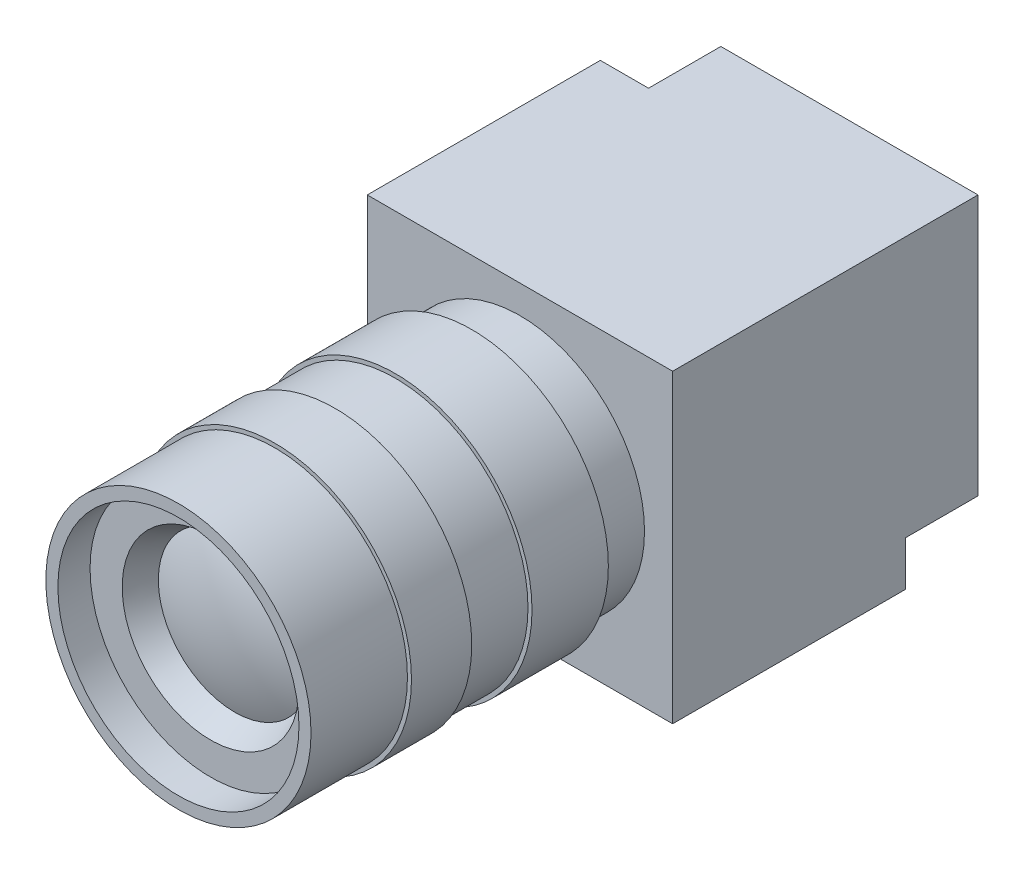
ISO-10303-21;
HEADER;
FILE_DESCRIPTION(('STEP AP214'),'2;1');
FILE_NAME('part.step','',(''),(''),'','','');
FILE_SCHEMA(('AUTOMOTIVE_DESIGN { 1 0 10303 214 1 1 1 1 }'));
ENDSEC;
DATA;
#1=APPLICATION_CONTEXT('core data for automotive mechanical design processes');
#2=APPLICATION_PROTOCOL_DEFINITION('international standard','automotive_design',2000,#1);
#3=PRODUCT_CONTEXT('',#1,'mechanical');
#4=PRODUCT('Part','Part','',(#3));
#5=PRODUCT_RELATED_PRODUCT_CATEGORY('part','',(#4));
#6=PRODUCT_DEFINITION_FORMATION('','',#4);
#7=PRODUCT_DEFINITION_CONTEXT('part definition',#1,'design');
#8=PRODUCT_DEFINITION('design','',#6,#7);
#9=PRODUCT_DEFINITION_SHAPE('','',#8);
#10=(LENGTH_UNIT() NAMED_UNIT(*) SI_UNIT(.MILLI.,.METRE.));
#11=(NAMED_UNIT(*) PLANE_ANGLE_UNIT() SI_UNIT($,.RADIAN.));
#12=(NAMED_UNIT(*) SI_UNIT($,.STERADIAN.) SOLID_ANGLE_UNIT());
#13=UNCERTAINTY_MEASURE_WITH_UNIT(LENGTH_MEASURE(1.E-05),#10,'distance_accuracy_value','');
#14=(GEOMETRIC_REPRESENTATION_CONTEXT(3) GLOBAL_UNCERTAINTY_ASSIGNED_CONTEXT((#13)) GLOBAL_UNIT_ASSIGNED_CONTEXT((#10,
#11,#12)) REPRESENTATION_CONTEXT('',''));
#15=CARTESIAN_POINT('',(0.,0.,0.));
#16=DIRECTION('',(0.,0.,1.));
#17=DIRECTION('',(1.,0.,0.));
#18=AXIS2_PLACEMENT_3D('',#15,#16,#17);
#19=CARTESIAN_POINT('',(-19.,19.,38.));
#20=DIRECTION('',(1.,0.,0.));
#21=DIRECTION('',(0.,1.,0.));
#22=AXIS2_PLACEMENT_3D('',#19,#20,#21);
#23=PLANE('',#22);
#24=DIRECTION('',(0.,1.,0.));
#25=VECTOR('',#24,1.);
#26=CARTESIAN_POINT('',(-19.,-19.,9.));
#27=LINE('',#26,#25);
#28=CARTESIAN_POINT('',(-19.,-19.,9.));
#29=VERTEX_POINT('',#28);
#30=CARTESIAN_POINT('',(-19.,19.,9.));
#31=VERTEX_POINT('',#30);
#32=EDGE_CURVE('E132',#29,#31,#27,.T.);
#33=ORIENTED_EDGE('',*,*,#32,.F.);
#34=DIRECTION('',(0.,0.,-1.));
#35=VECTOR('',#34,1.);
#36=CARTESIAN_POINT('',(-19.,-19.,38.));
#37=LINE('',#36,#35);
#38=CARTESIAN_POINT('',(-19.,-19.,38.));
#39=VERTEX_POINT('',#38);
#40=EDGE_CURVE('E11',#39,#29,#37,.T.);
#41=ORIENTED_EDGE('',*,*,#40,.F.);
#42=DIRECTION('',(0.,-1.,0.));
#43=VECTOR('',#42,1.);
#44=CARTESIAN_POINT('',(-19.,19.,38.));
#45=LINE('',#44,#43);
#46=CARTESIAN_POINT('',(-19.,19.,38.));
#47=VERTEX_POINT('',#46);
#48=EDGE_CURVE('E199',#47,#39,#45,.T.);
#49=ORIENTED_EDGE('',*,*,#48,.F.);
#50=DIRECTION('',(0.,0.,-1.));
#51=VECTOR('',#50,1.);
#52=CARTESIAN_POINT('',(-19.,19.,38.));
#53=LINE('',#52,#51);
#54=EDGE_CURVE('E206',#47,#31,#53,.T.);
#55=ORIENTED_EDGE('',*,*,#54,.T.);
#56=EDGE_LOOP('',(#33,#41,#49,#55));
#57=FACE_BOUND('',#56,.T.);
#58=ADVANCED_FACE('F30',(#57),#23,.F.);
#59=CARTESIAN_POINT('',(-19.,-19.,38.));
#60=DIRECTION('',(0.,1.,0.));
#61=DIRECTION('',(0.,0.,1.));
#62=AXIS2_PLACEMENT_3D('',#59,#60,#61);
#63=PLANE('',#62);
#64=DIRECTION('',(-1.,0.,0.));
#65=VECTOR('',#64,1.);
#66=CARTESIAN_POINT('',(19.,-19.,9.));
#67=LINE('',#66,#65);
#68=CARTESIAN_POINT('',(19.,-19.,9.));
#69=VERTEX_POINT('',#68);
#70=EDGE_CURVE('E130',#69,#29,#67,.T.);
#71=ORIENTED_EDGE('',*,*,#70,.F.);
#72=DIRECTION('',(0.,0.,-1.));
#73=VECTOR('',#72,1.);
#74=CARTESIAN_POINT('',(19.,-19.,38.));
#75=LINE('',#74,#73);
#76=CARTESIAN_POINT('',(19.,-19.,38.));
#77=VERTEX_POINT('',#76);
#78=EDGE_CURVE('E37',#77,#69,#75,.T.);
#79=ORIENTED_EDGE('',*,*,#78,.F.);
#80=DIRECTION('',(1.,0.,0.));
#81=VECTOR('',#80,1.);
#82=CARTESIAN_POINT('',(-19.,-19.,38.));
#83=LINE('',#82,#81);
#84=EDGE_CURVE('E201',#39,#77,#83,.T.);
#85=ORIENTED_EDGE('',*,*,#84,.F.);
#86=ORIENTED_EDGE('',*,*,#40,.T.);
#87=EDGE_LOOP('',(#71,#79,#85,#86));
#88=FACE_BOUND('',#87,.T.);
#89=ADVANCED_FACE('F220',(#88),#63,.F.);
#90=CARTESIAN_POINT('',(0.,0.,80.5));
#91=DIRECTION('',(0.,0.,1.));
#92=DIRECTION('',(1.,0.,0.));
#93=AXIS2_PLACEMENT_3D('',#90,#91,#92);
#94=PLANE('',#93);
#95=CARTESIAN_POINT('',(0.,0.,80.5));
#96=DIRECTION('',(0.,0.,1.));
#97=DIRECTION('',(1.,0.,0.));
#98=AXIS2_PLACEMENT_3D('',#95,#96,#97);
#99=CIRCLE('',#98,16.5);
#100=CARTESIAN_POINT('',(16.5,0.,80.5));
#101=VERTEX_POINT('',#100);
#102=EDGE_CURVE('E168',#101,#101,#99,.T.);
#103=ORIENTED_EDGE('',*,*,#102,.T.);
#104=EDGE_LOOP('',(#103));
#105=FACE_BOUND('',#104,.T.);
#106=CARTESIAN_POINT('',(0.,0.,80.5));
#107=DIRECTION('',(0.,0.,1.));
#108=DIRECTION('',(1.,0.,0.));
#109=AXIS2_PLACEMENT_3D('',#106,#107,#108);
#110=CIRCLE('',#109,15.);
#111=CARTESIAN_POINT('',(15.,0.,80.5));
#112=VERTEX_POINT('',#111);
#113=EDGE_CURVE('E149',#112,#112,#110,.T.);
#114=ORIENTED_EDGE('',*,*,#113,.F.);
#115=EDGE_LOOP('',(#114));
#116=FACE_BOUND('',#115,.T.);
#117=ADVANCED_FACE('F249',(#105,#116),#94,.T.);
#118=CARTESIAN_POINT('',(0.,0.,68.5));
#119=DIRECTION('',(0.,0.,1.));
#120=DIRECTION('',(1.,0.,0.));
#121=AXIS2_PLACEMENT_3D('',#118,#119,#120);
#122=PLANE('',#121);
#123=CARTESIAN_POINT('',(0.,0.,68.5));
#124=DIRECTION('',(0.,0.,1.));
#125=DIRECTION('',(1.,0.,0.));
#126=AXIS2_PLACEMENT_3D('',#123,#124,#125);
#127=CIRCLE('',#126,17.);
#128=CARTESIAN_POINT('',(17.,0.,68.5));
#129=VERTEX_POINT('',#128);
#130=EDGE_CURVE('E174',#129,#129,#127,.T.);
#131=ORIENTED_EDGE('',*,*,#130,.T.);
#132=EDGE_LOOP('',(#131));
#133=FACE_BOUND('',#132,.T.);
#134=CARTESIAN_POINT('',(0.,0.,68.5));
#135=DIRECTION('',(0.,0.,1.));
#136=DIRECTION('',(1.,0.,0.));
#137=AXIS2_PLACEMENT_3D('',#134,#135,#136);
#138=CIRCLE('',#137,16.5);
#139=CARTESIAN_POINT('',(16.5,0.,68.5));
#140=VERTEX_POINT('',#139);
#141=EDGE_CURVE('E165',#140,#140,#138,.T.);
#142=ORIENTED_EDGE('',*,*,#141,.F.);
#143=EDGE_LOOP('',(#142));
#144=FACE_BOUND('',#143,.T.);
#145=ADVANCED_FACE('F253',(#133,#144),#122,.T.);
#146=CARTESIAN_POINT('',(0.,0.,53.5));
#147=DIRECTION('',(0.,0.,1.));
#148=DIRECTION('',(1.,0.,0.));
#149=AXIS2_PLACEMENT_3D('',#146,#147,#148);
#150=PLANE('',#149);
#151=CARTESIAN_POINT('',(0.,0.,53.5));
#152=DIRECTION('',(0.,0.,1.));
#153=DIRECTION('',(1.,0.,0.));
#154=AXIS2_PLACEMENT_3D('',#151,#152,#153);
#155=CIRCLE('',#154,17.);
#156=CARTESIAN_POINT('',(17.,0.,53.5));
#157=VERTEX_POINT('',#156);
#158=EDGE_CURVE('E186',#157,#157,#155,.T.);
#159=ORIENTED_EDGE('',*,*,#158,.T.);
#160=EDGE_LOOP('',(#159));
#161=FACE_BOUND('',#160,.T.);
#162=CARTESIAN_POINT('',(0.,0.,53.5));
#163=DIRECTION('',(0.,0.,1.));
#164=DIRECTION('',(1.,0.,0.));
#165=AXIS2_PLACEMENT_3D('',#162,#163,#164);
#166=CIRCLE('',#165,16.5);
#167=CARTESIAN_POINT('',(16.5,0.,53.5));
#168=VERTEX_POINT('',#167);
#169=EDGE_CURVE('E177',#168,#168,#166,.T.);
#170=ORIENTED_EDGE('',*,*,#169,.F.);
#171=EDGE_LOOP('',(#170));
#172=FACE_BOUND('',#171,.T.);
#173=ADVANCED_FACE('F264',(#161,#172),#150,.T.);
#174=CARTESIAN_POINT('',(-19.,-19.,38.));
#175=DIRECTION('',(0.,0.,1.));
#176=DIRECTION('',(1.,0.,0.));
#177=AXIS2_PLACEMENT_3D('',#174,#175,#176);
#178=PLANE('',#177);
#179=ORIENTED_EDGE('',*,*,#48,.T.);
#180=ORIENTED_EDGE('',*,*,#84,.T.);
#181=DIRECTION('',(0.,1.,0.));
#182=VECTOR('',#181,1.);
#183=CARTESIAN_POINT('',(19.,19.,38.));
#184=LINE('',#183,#182);
#185=CARTESIAN_POINT('',(19.,19.,38.));
#186=VERTEX_POINT('',#185);
#187=EDGE_CURVE('E203',#77,#186,#184,.T.);
#188=ORIENTED_EDGE('',*,*,#187,.T.);
#189=DIRECTION('',(-1.,0.,0.));
#190=VECTOR('',#189,1.);
#191=CARTESIAN_POINT('',(-19.,19.,38.));
#192=LINE('',#191,#190);
#193=EDGE_CURVE('E52',#186,#47,#192,.T.);
#194=ORIENTED_EDGE('',*,*,#193,.T.);
#195=EDGE_LOOP('',(#179,#180,#188,#194));
#196=FACE_BOUND('',#195,.T.);
#197=CARTESIAN_POINT('',(0.,0.,38.));
#198=DIRECTION('',(0.,0.,1.));
#199=DIRECTION('',(1.,0.,0.));
#200=AXIS2_PLACEMENT_3D('',#197,#198,#199);
#201=CIRCLE('',#200,15.5);
#202=CARTESIAN_POINT('',(15.5,0.,38.));
#203=VERTEX_POINT('',#202);
#204=EDGE_CURVE('E189',#203,#203,#201,.T.);
#205=ORIENTED_EDGE('',*,*,#204,.F.);
#206=EDGE_LOOP('',(#205));
#207=FACE_BOUND('',#206,.T.);
#208=ADVANCED_FACE('F259',(#196,#207),#178,.T.);
#209=CARTESIAN_POINT('',(19.,19.,38.));
#210=DIRECTION('',(-1.,0.,0.));
#211=DIRECTION('',(0.,-1.,0.));
#212=AXIS2_PLACEMENT_3D('',#209,#210,#211);
#213=PLANE('',#212);
#214=DIRECTION('',(0.,-1.,0.));
#215=VECTOR('',#214,1.);
#216=CARTESIAN_POINT('',(19.,-13.4399999999997,9.));
#217=LINE('',#216,#215);
#218=CARTESIAN_POINT('',(19.,-13.4399999999997,9.));
#219=VERTEX_POINT('',#218);
#220=EDGE_CURVE('E128',#219,#69,#217,.T.);
#221=ORIENTED_EDGE('',*,*,#220,.F.);
#222=DIRECTION('',(0.,0.,-1.));
#223=VECTOR('',#222,1.);
#224=CARTESIAN_POINT('',(19.,-13.4399999999997,9.));
#225=LINE('',#224,#223);
#226=CARTESIAN_POINT('',(19.,-13.4399999999997,0.));
#227=VERTEX_POINT('',#226);
#228=EDGE_CURVE('E146',#219,#227,#225,.T.);
#229=ORIENTED_EDGE('',*,*,#228,.T.);
#230=DIRECTION('',(0.,1.,0.));
#231=VECTOR('',#230,1.);
#232=CARTESIAN_POINT('',(19.,19.,0.));
#233=LINE('',#232,#231);
#234=CARTESIAN_POINT('',(19.,19.,0.));
#235=VERTEX_POINT('',#234);
#236=EDGE_CURVE('E195',#227,#235,#233,.T.);
#237=ORIENTED_EDGE('',*,*,#236,.T.);
#238=DIRECTION('',(0.,0.,-1.));
#239=VECTOR('',#238,1.);
#240=CARTESIAN_POINT('',(19.,19.,38.));
#241=LINE('',#240,#239);
#242=EDGE_CURVE('E209',#186,#235,#241,.T.);
#243=ORIENTED_EDGE('',*,*,#242,.F.);
#244=ORIENTED_EDGE('',*,*,#187,.F.);
#245=ORIENTED_EDGE('',*,*,#78,.T.);
#246=EDGE_LOOP('',(#221,#229,#237,#243,#244,#245));
#247=FACE_BOUND('',#246,.T.);
#248=ADVANCED_FACE('F216',(#247),#213,.F.);
#249=CARTESIAN_POINT('',(-19.,19.,38.));
#250=DIRECTION('',(0.,-1.,0.));
#251=DIRECTION('',(0.,0.,-1.));
#252=AXIS2_PLACEMENT_3D('',#249,#250,#251);
#253=PLANE('',#252);
#254=DIRECTION('',(-1.,0.,0.));
#255=VECTOR('',#254,1.);
#256=CARTESIAN_POINT('',(-19.,19.,0.));
#257=LINE('',#256,#255);
#258=CARTESIAN_POINT('',(-13.,19.,0.));
#259=VERTEX_POINT('',#258);
#260=EDGE_CURVE('E197',#235,#259,#257,.T.);
#261=ORIENTED_EDGE('',*,*,#260,.T.);
#262=DIRECTION('',(0.,0.,-1.));
#263=VECTOR('',#262,1.);
#264=CARTESIAN_POINT('',(-13.,19.,9.));
#265=LINE('',#264,#263);
#266=CARTESIAN_POINT('',(-13.,19.,9.));
#267=VERTEX_POINT('',#266);
#268=EDGE_CURVE('E44',#267,#259,#265,.T.);
#269=ORIENTED_EDGE('',*,*,#268,.F.);
#270=DIRECTION('',(1.,0.,0.));
#271=VECTOR('',#270,1.);
#272=CARTESIAN_POINT('',(-19.,19.,9.));
#273=LINE('',#272,#271);
#274=EDGE_CURVE('E134',#31,#267,#273,.T.);
#275=ORIENTED_EDGE('',*,*,#274,.F.);
#276=ORIENTED_EDGE('',*,*,#54,.F.);
#277=ORIENTED_EDGE('',*,*,#193,.F.);
#278=ORIENTED_EDGE('',*,*,#242,.T.);
#279=EDGE_LOOP('',(#261,#269,#275,#276,#277,#278));
#280=FACE_BOUND('',#279,.T.);
#281=ADVANCED_FACE('F229',(#280),#253,.F.);
#282=CARTESIAN_POINT('',(-19.,-19.,0.));
#283=DIRECTION('',(0.,0.,1.));
#284=DIRECTION('',(1.,0.,0.));
#285=AXIS2_PLACEMENT_3D('',#282,#283,#284);
#286=PLANE('',#285);
#287=ORIENTED_EDGE('',*,*,#236,.F.);
#288=DIRECTION('',(1.,0.,0.));
#289=VECTOR('',#288,1.);
#290=CARTESIAN_POINT('',(11.,-13.4399999999997,0.));
#291=LINE('',#290,#289);
#292=CARTESIAN_POINT('',(11.,-13.4399999999997,0.));
#293=VERTEX_POINT('',#292);
#294=EDGE_CURVE('E124',#293,#227,#291,.T.);
#295=ORIENTED_EDGE('',*,*,#294,.F.);
#296=DIRECTION('',(0.,-1.,0.));
#297=VECTOR('',#296,1.);
#298=CARTESIAN_POINT('',(11.,-4.,0.));
#299=LINE('',#298,#297);
#300=CARTESIAN_POINT('',(11.,-4.,0.));
#301=VERTEX_POINT('',#300);
#302=EDGE_CURVE('E122',#301,#293,#299,.T.);
#303=ORIENTED_EDGE('',*,*,#302,.F.);
#304=DIRECTION('',(1.,0.,0.));
#305=VECTOR('',#304,1.);
#306=CARTESIAN_POINT('',(-13.,-4.,0.));
#307=LINE('',#306,#305);
#308=CARTESIAN_POINT('',(-13.,-4.,0.));
#309=VERTEX_POINT('',#308);
#310=EDGE_CURVE('E105',#309,#301,#307,.T.);
#311=ORIENTED_EDGE('',*,*,#310,.F.);
#312=DIRECTION('',(0.,-1.,0.));
#313=VECTOR('',#312,1.);
#314=CARTESIAN_POINT('',(-13.,19.,0.));
#315=LINE('',#314,#313);
#316=EDGE_CURVE('E112',#259,#309,#315,.T.);
#317=ORIENTED_EDGE('',*,*,#316,.F.);
#318=ORIENTED_EDGE('',*,*,#260,.F.);
#319=EDGE_LOOP('',(#287,#295,#303,#311,#317,#318));
#320=FACE_BOUND('',#319,.T.);
#321=ADVANCED_FACE('F119',(#320),#286,.F.);
#322=CARTESIAN_POINT('',(0.,0.,44.));
#323=DIRECTION('',(0.,0.,-1.));
#324=DIRECTION('',(-1.,0.,0.));
#325=AXIS2_PLACEMENT_3D('',#322,#323,#324);
#326=CYLINDRICAL_SURFACE('',#325,15.5);
#327=CARTESIAN_POINT('',(0.,0.,44.));
#328=DIRECTION('',(0.,0.,1.));
#329=DIRECTION('',(1.,0.,0.));
#330=AXIS2_PLACEMENT_3D('',#327,#328,#329);
#331=CIRCLE('',#330,15.5);
#332=CARTESIAN_POINT('',(15.5,0.,44.));
#333=VERTEX_POINT('',#332);
#334=EDGE_CURVE('E192',#333,#333,#331,.T.);
#335=ORIENTED_EDGE('',*,*,#334,.F.);
#336=EDGE_LOOP('',(#335));
#337=FACE_BOUND('',#336,.T.);
#338=ORIENTED_EDGE('',*,*,#204,.T.);
#339=EDGE_LOOP('',(#338));
#340=FACE_BOUND('',#339,.T.);
#341=ADVANCED_FACE('F267',(#337,#340),#326,.T.);
#342=CARTESIAN_POINT('',(0.,0.,44.));
#343=DIRECTION('',(0.,0.,1.));
#344=DIRECTION('',(1.,0.,0.));
#345=AXIS2_PLACEMENT_3D('',#342,#343,#344);
#346=PLANE('',#345);
#347=CARTESIAN_POINT('',(0.,0.,44.));
#348=DIRECTION('',(0.,0.,1.));
#349=DIRECTION('',(1.,0.,0.));
#350=AXIS2_PLACEMENT_3D('',#347,#348,#349);
#351=CIRCLE('',#350,17.);
#352=CARTESIAN_POINT('',(17.,0.,44.));
#353=VERTEX_POINT('',#352);
#354=EDGE_CURVE('E183',#353,#353,#351,.T.);
#355=ORIENTED_EDGE('',*,*,#354,.F.);
#356=EDGE_LOOP('',(#355));
#357=FACE_BOUND('',#356,.T.);
#358=ORIENTED_EDGE('',*,*,#334,.T.);
#359=EDGE_LOOP('',(#358));
#360=FACE_BOUND('',#359,.T.);
#361=ADVANCED_FACE('F270',(#357,#360),#346,.F.);
#362=CARTESIAN_POINT('',(0.,0.,53.5));
#363=DIRECTION('',(0.,0.,-1.));
#364=DIRECTION('',(-1.,0.,0.));
#365=AXIS2_PLACEMENT_3D('',#362,#363,#364);
#366=CYLINDRICAL_SURFACE('',#365,17.);
#367=ORIENTED_EDGE('',*,*,#158,.F.);
#368=EDGE_LOOP('',(#367));
#369=FACE_BOUND('',#368,.T.);
#370=ORIENTED_EDGE('',*,*,#354,.T.);
#371=EDGE_LOOP('',(#370));
#372=FACE_BOUND('',#371,.T.);
#373=ADVANCED_FACE('F272',(#369,#372),#366,.T.);
#374=CARTESIAN_POINT('',(0.,0.,61.));
#375=DIRECTION('',(0.,0.,-1.));
#376=DIRECTION('',(-1.,0.,0.));
#377=AXIS2_PLACEMENT_3D('',#374,#375,#376);
#378=CYLINDRICAL_SURFACE('',#377,16.5);
#379=CARTESIAN_POINT('',(0.,0.,61.));
#380=DIRECTION('',(0.,0.,1.));
#381=DIRECTION('',(1.,0.,0.));
#382=AXIS2_PLACEMENT_3D('',#379,#380,#381);
#383=CIRCLE('',#382,16.5);
#384=CARTESIAN_POINT('',(16.5,0.,61.));
#385=VERTEX_POINT('',#384);
#386=EDGE_CURVE('E180',#385,#385,#383,.T.);
#387=ORIENTED_EDGE('',*,*,#386,.F.);
#388=EDGE_LOOP('',(#387));
#389=FACE_BOUND('',#388,.T.);
#390=ORIENTED_EDGE('',*,*,#169,.T.);
#391=EDGE_LOOP('',(#390));
#392=FACE_BOUND('',#391,.T.);
#393=ADVANCED_FACE('F275',(#389,#392),#378,.T.);
#394=CARTESIAN_POINT('',(0.,0.,61.));
#395=DIRECTION('',(0.,0.,1.));
#396=DIRECTION('',(1.,0.,0.));
#397=AXIS2_PLACEMENT_3D('',#394,#395,#396);
#398=PLANE('',#397);
#399=CARTESIAN_POINT('',(0.,0.,61.));
#400=DIRECTION('',(0.,0.,1.));
#401=DIRECTION('',(1.,0.,0.));
#402=AXIS2_PLACEMENT_3D('',#399,#400,#401);
#403=CIRCLE('',#402,17.);
#404=CARTESIAN_POINT('',(17.,0.,61.));
#405=VERTEX_POINT('',#404);
#406=EDGE_CURVE('E171',#405,#405,#403,.T.);
#407=ORIENTED_EDGE('',*,*,#406,.F.);
#408=EDGE_LOOP('',(#407));
#409=FACE_BOUND('',#408,.T.);
#410=ORIENTED_EDGE('',*,*,#386,.T.);
#411=EDGE_LOOP('',(#410));
#412=FACE_BOUND('',#411,.T.);
#413=ADVANCED_FACE('F285',(#409,#412),#398,.F.);
#414=CARTESIAN_POINT('',(0.,0.,68.5));
#415=DIRECTION('',(0.,0.,-1.));
#416=DIRECTION('',(-1.,0.,0.));
#417=AXIS2_PLACEMENT_3D('',#414,#415,#416);
#418=CYLINDRICAL_SURFACE('',#417,17.);
#419=ORIENTED_EDGE('',*,*,#130,.F.);
#420=EDGE_LOOP('',(#419));
#421=FACE_BOUND('',#420,.T.);
#422=ORIENTED_EDGE('',*,*,#406,.T.);
#423=EDGE_LOOP('',(#422));
#424=FACE_BOUND('',#423,.T.);
#425=ADVANCED_FACE('F287',(#421,#424),#418,.T.);
#426=CARTESIAN_POINT('',(0.,0.,80.5));
#427=DIRECTION('',(0.,0.,-1.));
#428=DIRECTION('',(-1.,0.,0.));
#429=AXIS2_PLACEMENT_3D('',#426,#427,#428);
#430=CYLINDRICAL_SURFACE('',#429,16.5);
#431=ORIENTED_EDGE('',*,*,#102,.F.);
#432=EDGE_LOOP('',(#431));
#433=FACE_BOUND('',#432,.T.);
#434=ORIENTED_EDGE('',*,*,#141,.T.);
#435=EDGE_LOOP('',(#434));
#436=FACE_BOUND('',#435,.T.);
#437=ADVANCED_FACE('F290',(#433,#436),#430,.T.);
#438=CARTESIAN_POINT('',(0.,0.,50.5));
#439=DIRECTION('',(0.,0.,1.));
#440=DIRECTION('',(-1.,0.,0.));
#441=AXIS2_PLACEMENT_3D('',#438,#439,#440);
#442=SPHERICAL_SURFACE('',#441,24.8847342762586);
#443=CARTESIAN_POINT('',(0.,0.,73.4999999999999));
#444=DIRECTION('',(0.,0.,1.));
#445=DIRECTION('',(1.,0.,0.));
#446=AXIS2_PLACEMENT_3D('',#443,#444,#445);
#447=CIRCLE('',#446,9.49999999999998);
#448=CARTESIAN_POINT('',(9.49999999999995,0.,73.4999999999999));
#449=VERTEX_POINT('',#448);
#450=EDGE_CURVE('E162',#449,#449,#447,.T.);
#451=ORIENTED_EDGE('',*,*,#450,.T.);
#452=EDGE_LOOP('',(#451));
#453=FACE_BOUND('',#452,.T.);
#454=ADVANCED_FACE('F299',(#453),#442,.T.);
#455=CARTESIAN_POINT('',(0.,0.,73.4999999999999));
#456=DIRECTION('',(0.,0.,1.));
#457=DIRECTION('',(1.,0.,0.));
#458=AXIS2_PLACEMENT_3D('',#455,#456,#457);
#459=CONICAL_SURFACE('',#458,9.49999999999998,0.463647609000794);
#460=CARTESIAN_POINT('',(0.,0.,76.5));
#461=DIRECTION('',(0.,0.,1.));
#462=DIRECTION('',(1.,0.,0.));
#463=AXIS2_PLACEMENT_3D('',#460,#461,#462);
#464=CIRCLE('',#463,11.);
#465=CARTESIAN_POINT('',(11.,0.,76.5));
#466=VERTEX_POINT('',#465);
#467=EDGE_CURVE('E159',#466,#466,#464,.T.);
#468=ORIENTED_EDGE('',*,*,#467,.T.);
#469=EDGE_LOOP('',(#468));
#470=FACE_BOUND('',#469,.T.);
#471=ORIENTED_EDGE('',*,*,#450,.F.);
#472=EDGE_LOOP('',(#471));
#473=FACE_BOUND('',#472,.T.);
#474=ADVANCED_FACE('F304',(#470,#473),#459,.F.);
#475=CARTESIAN_POINT('',(-15.,0.,76.5));
#476=DIRECTION('',(0.,0.,1.));
#477=DIRECTION('',(1.,0.,0.));
#478=AXIS2_PLACEMENT_3D('',#475,#476,#477);
#479=PLANE('',#478);
#480=CARTESIAN_POINT('',(0.,0.,76.5));
#481=DIRECTION('',(0.,0.,1.));
#482=DIRECTION('',(1.,0.,0.));
#483=AXIS2_PLACEMENT_3D('',#480,#481,#482);
#484=CIRCLE('',#483,15.);
#485=CARTESIAN_POINT('',(15.,0.,76.5));
#486=VERTEX_POINT('',#485);
#487=EDGE_CURVE('E156',#486,#486,#484,.T.);
#488=ORIENTED_EDGE('',*,*,#487,.T.);
#489=EDGE_LOOP('',(#488));
#490=FACE_BOUND('',#489,.T.);
#491=ORIENTED_EDGE('',*,*,#467,.F.);
#492=EDGE_LOOP('',(#491));
#493=FACE_BOUND('',#492,.T.);
#494=ADVANCED_FACE('F308',(#490,#493),#479,.T.);
#495=CARTESIAN_POINT('',(3.49148336110938E-12,0.,1080.5));
#496=DIRECTION('',(0.,0.,1.));
#497=DIRECTION('',(1.,0.,0.));
#498=AXIS2_PLACEMENT_3D('',#495,#496,#497);
#499=CYLINDRICAL_SURFACE('',#498,15.);
#500=ORIENTED_EDGE('',*,*,#113,.T.);
#501=EDGE_LOOP('',(#500));
#502=FACE_BOUND('',#501,.T.);
#503=ORIENTED_EDGE('',*,*,#487,.F.);
#504=EDGE_LOOP('',(#503));
#505=FACE_BOUND('',#504,.T.);
#506=ADVANCED_FACE('F243',(#502,#505),#499,.F.);
#507=CARTESIAN_POINT('',(11.,-13.4399999999997,9.));
#508=DIRECTION('',(0.,1.,0.));
#509=DIRECTION('',(-1.,0.,0.));
#510=AXIS2_PLACEMENT_3D('',#507,#508,#509);
#511=PLANE('',#510);
#512=ORIENTED_EDGE('',*,*,#294,.T.);
#513=ORIENTED_EDGE('',*,*,#228,.F.);
#514=DIRECTION('',(1.,0.,0.));
#515=VECTOR('',#514,1.);
#516=CARTESIAN_POINT('',(11.,-13.4399999999997,9.));
#517=LINE('',#516,#515);
#518=CARTESIAN_POINT('',(11.,-13.4399999999997,9.));
#519=VERTEX_POINT('',#518);
#520=EDGE_CURVE('E143',#519,#219,#517,.T.);
#521=ORIENTED_EDGE('',*,*,#520,.F.);
#522=DIRECTION('',(0.,0.,-1.));
#523=VECTOR('',#522,1.);
#524=CARTESIAN_POINT('',(11.,-13.4399999999997,9.));
#525=LINE('',#524,#523);
#526=EDGE_CURVE('E150',#519,#293,#525,.T.);
#527=ORIENTED_EDGE('',*,*,#526,.T.);
#528=EDGE_LOOP('',(#512,#513,#521,#527));
#529=FACE_BOUND('',#528,.T.);
#530=ADVANCED_FACE('F234',(#529),#511,.F.);
#531=CARTESIAN_POINT('',(11.,-4.,9.));
#532=DIRECTION('',(1.,0.,0.));
#533=DIRECTION('',(0.,0.,-1.));
#534=AXIS2_PLACEMENT_3D('',#531,#532,#533);
#535=PLANE('',#534);
#536=ORIENTED_EDGE('',*,*,#302,.T.);
#537=ORIENTED_EDGE('',*,*,#526,.F.);
#538=DIRECTION('',(0.,-1.,0.));
#539=VECTOR('',#538,1.);
#540=CARTESIAN_POINT('',(11.,-4.,9.));
#541=LINE('',#540,#539);
#542=CARTESIAN_POINT('',(11.,-4.,9.));
#543=VERTEX_POINT('',#542);
#544=EDGE_CURVE('E140',#543,#519,#541,.T.);
#545=ORIENTED_EDGE('',*,*,#544,.F.);
#546=DIRECTION('',(0.,0.,-1.));
#547=VECTOR('',#546,1.);
#548=CARTESIAN_POINT('',(11.,-4.,9.));
#549=LINE('',#548,#547);
#550=EDGE_CURVE('E110',#543,#301,#549,.T.);
#551=ORIENTED_EDGE('',*,*,#550,.T.);
#552=EDGE_LOOP('',(#536,#537,#545,#551));
#553=FACE_BOUND('',#552,.T.);
#554=ADVANCED_FACE('F235',(#553),#535,.F.);
#555=CARTESIAN_POINT('',(-13.,-4.,9.));
#556=DIRECTION('',(0.,1.,0.));
#557=DIRECTION('',(-1.,0.,0.));
#558=AXIS2_PLACEMENT_3D('',#555,#556,#557);
#559=PLANE('',#558);
#560=ORIENTED_EDGE('',*,*,#310,.T.);
#561=ORIENTED_EDGE('',*,*,#550,.F.);
#562=DIRECTION('',(1.,0.,0.));
#563=VECTOR('',#562,1.);
#564=CARTESIAN_POINT('',(-13.,-4.,9.));
#565=LINE('',#564,#563);
#566=CARTESIAN_POINT('',(-13.,-4.,9.));
#567=VERTEX_POINT('',#566);
#568=EDGE_CURVE('E108',#567,#543,#565,.T.);
#569=ORIENTED_EDGE('',*,*,#568,.F.);
#570=DIRECTION('',(0.,0.,-1.));
#571=VECTOR('',#570,1.);
#572=CARTESIAN_POINT('',(-13.,-4.,9.));
#573=LINE('',#572,#571);
#574=EDGE_CURVE('E102',#567,#309,#573,.T.);
#575=ORIENTED_EDGE('',*,*,#574,.T.);
#576=EDGE_LOOP('',(#560,#561,#569,#575));
#577=FACE_BOUND('',#576,.T.);
#578=ADVANCED_FACE('F103',(#577),#559,.F.);
#579=CARTESIAN_POINT('',(-13.,19.,9.));
#580=DIRECTION('',(1.,0.,0.));
#581=DIRECTION('',(0.,1.,0.));
#582=AXIS2_PLACEMENT_3D('',#579,#580,#581);
#583=PLANE('',#582);
#584=ORIENTED_EDGE('',*,*,#316,.T.);
#585=ORIENTED_EDGE('',*,*,#574,.F.);
#586=DIRECTION('',(0.,-1.,0.));
#587=VECTOR('',#586,1.);
#588=CARTESIAN_POINT('',(-13.,19.,9.));
#589=LINE('',#588,#587);
#590=EDGE_CURVE('E137',#267,#567,#589,.T.);
#591=ORIENTED_EDGE('',*,*,#590,.F.);
#592=ORIENTED_EDGE('',*,*,#268,.T.);
#593=EDGE_LOOP('',(#584,#585,#591,#592));
#594=FACE_BOUND('',#593,.T.);
#595=ADVANCED_FACE('F113',(#594),#583,.F.);
#596=CARTESIAN_POINT('',(19.,-19.,9.));
#597=DIRECTION('',(0.,0.,-1.));
#598=DIRECTION('',(-1.,0.,0.));
#599=AXIS2_PLACEMENT_3D('',#596,#597,#598);
#600=PLANE('',#599);
#601=ORIENTED_EDGE('',*,*,#220,.T.);
#602=ORIENTED_EDGE('',*,*,#70,.T.);
#603=ORIENTED_EDGE('',*,*,#32,.T.);
#604=ORIENTED_EDGE('',*,*,#274,.T.);
#605=ORIENTED_EDGE('',*,*,#590,.T.);
#606=ORIENTED_EDGE('',*,*,#568,.T.);
#607=ORIENTED_EDGE('',*,*,#544,.T.);
#608=ORIENTED_EDGE('',*,*,#520,.T.);
#609=EDGE_LOOP('',(#601,#602,#603,#604,#605,#606,#607,#608));
#610=FACE_BOUND('',#609,.T.);
#611=ADVANCED_FACE('F224',(#610),#600,.T.);
#612=CLOSED_SHELL('',(#58,#89,#117,#145,#173,#208,#248,#281,#321,#341,#361,#373,#393,#413,#425,
#437,#454,#474,#494,#506,#530,#554,#578,#595,#611));
#613=MANIFOLD_SOLID_BREP('B2',#612);
#614=ADVANCED_BREP_SHAPE_REPRESENTATION('',(#18,#613),#14);
#615=SHAPE_DEFINITION_REPRESENTATION(#9,#614);
ENDSEC;
END-ISO-10303-21;
